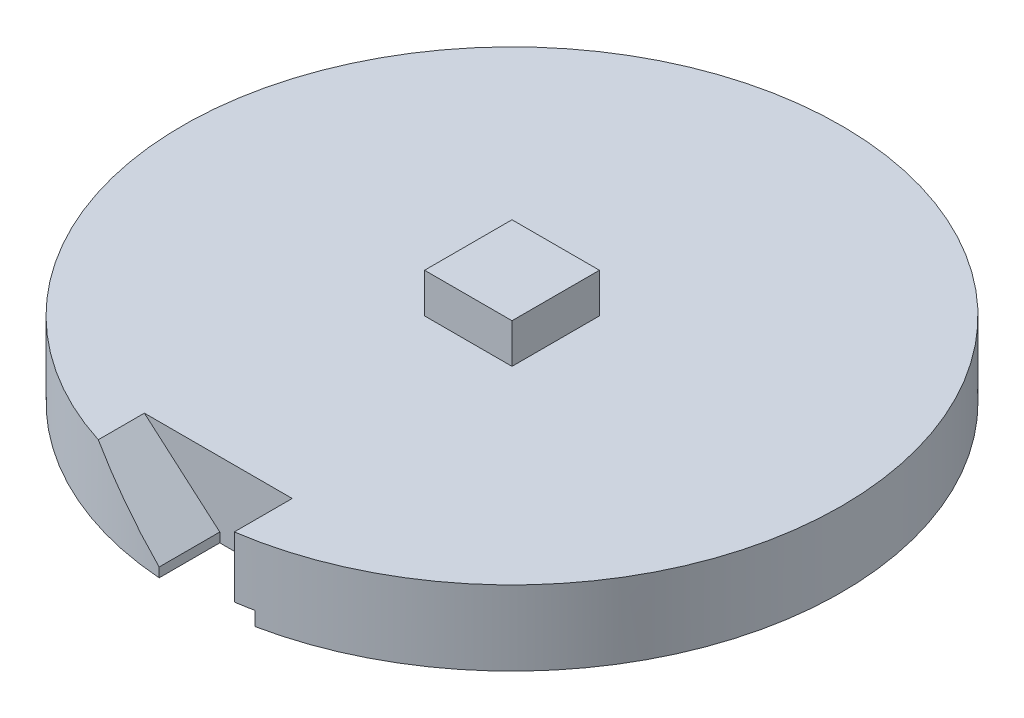
ISO-10303-21;
HEADER;
FILE_DESCRIPTION(('STEP AP214'),'2;1');
FILE_NAME('part.step','',(''),(''),'','','');
FILE_SCHEMA(('AUTOMOTIVE_DESIGN { 1 0 10303 214 1 1 1 1 }'));
ENDSEC;
DATA;
#1=APPLICATION_CONTEXT('core data for automotive mechanical design processes');
#2=APPLICATION_PROTOCOL_DEFINITION('international standard','automotive_design',2000,#1);
#3=PRODUCT_CONTEXT('',#1,'mechanical');
#4=PRODUCT('Part','Part','',(#3));
#5=PRODUCT_RELATED_PRODUCT_CATEGORY('part','',(#4));
#6=PRODUCT_DEFINITION_FORMATION('','',#4);
#7=PRODUCT_DEFINITION_CONTEXT('part definition',#1,'design');
#8=PRODUCT_DEFINITION('design','',#6,#7);
#9=PRODUCT_DEFINITION_SHAPE('','',#8);
#10=(LENGTH_UNIT() NAMED_UNIT(*) SI_UNIT(.MILLI.,.METRE.));
#11=(NAMED_UNIT(*) PLANE_ANGLE_UNIT() SI_UNIT($,.RADIAN.));
#12=(NAMED_UNIT(*) SI_UNIT($,.STERADIAN.) SOLID_ANGLE_UNIT());
#13=UNCERTAINTY_MEASURE_WITH_UNIT(LENGTH_MEASURE(1.E-05),#10,'distance_accuracy_value','');
#14=(GEOMETRIC_REPRESENTATION_CONTEXT(3) GLOBAL_UNCERTAINTY_ASSIGNED_CONTEXT((#13)) GLOBAL_UNIT_ASSIGNED_CONTEXT((#10,
#11,#12)) REPRESENTATION_CONTEXT('',''));
#15=CARTESIAN_POINT('',(0.,0.,0.));
#16=DIRECTION('',(0.,0.,1.));
#17=DIRECTION('',(1.,0.,0.));
#18=AXIS2_PLACEMENT_3D('',#15,#16,#17);
#19=CARTESIAN_POINT('',(0.,8.5,0.));
#20=DIRECTION('',(0.,1.,0.));
#21=DIRECTION('',(0.,0.,1.));
#22=AXIS2_PLACEMENT_3D('',#19,#20,#21);
#23=PLANE('',#22);
#24=DIRECTION('',(0.,0.,1.));
#25=VECTOR('',#24,1.);
#26=CARTESIAN_POINT('',(-11.3352998065365,8.5,30.5));
#27=LINE('',#26,#25);
#28=CARTESIAN_POINT('',(-11.3352998065365,8.5,30.5));
#29=VERTEX_POINT('',#28);
#30=CARTESIAN_POINT('',(-11.3352998065365,8.5,35.7457826644757));
#31=VERTEX_POINT('',#30);
#32=EDGE_CURVE('E282',#29,#31,#27,.T.);
#33=ORIENTED_EDGE('',*,*,#32,.F.);
#34=DIRECTION('',(-1.,0.,0.));
#35=VECTOR('',#34,1.);
#36=CARTESIAN_POINT('',(5.48783229101683,8.5,30.5));
#37=LINE('',#36,#35);
#38=CARTESIAN_POINT('',(5.48783229101683,8.5,30.5));
#39=VERTEX_POINT('',#38);
#40=EDGE_CURVE('E280',#39,#29,#37,.T.);
#41=ORIENTED_EDGE('',*,*,#40,.F.);
#42=DIRECTION('',(0.,0.,1.));
#43=VECTOR('',#42,1.);
#44=CARTESIAN_POINT('',(5.48783229101683,8.5,30.5));
#45=LINE('',#44,#43);
#46=CARTESIAN_POINT('',(5.48783229101683,8.5,37.0962760495669));
#47=VERTEX_POINT('',#46);
#48=EDGE_CURVE('E274',#39,#47,#45,.T.);
#49=ORIENTED_EDGE('',*,*,#48,.T.);
#50=CARTESIAN_POINT('',(0.,8.5,0.));
#51=DIRECTION('',(0.,1.,0.));
#52=DIRECTION('',(0.,0.,1.));
#53=AXIS2_PLACEMENT_3D('',#50,#51,#52);
#54=CIRCLE('',#53,37.5);
#55=EDGE_CURVE('E253',#47,#31,#54,.T.);
#56=ORIENTED_EDGE('',*,*,#55,.T.);
#57=EDGE_LOOP('',(#33,#41,#49,#56));
#58=FACE_BOUND('',#57,.T.);
#59=DIRECTION('',(1.,0.,0.));
#60=VECTOR('',#59,1.);
#61=CARTESIAN_POINT('',(0.,8.5,-4.975));
#62=LINE('',#61,#60);
#63=CARTESIAN_POINT('',(-4.975,8.5,-4.975));
#64=VERTEX_POINT('',#63);
#65=CARTESIAN_POINT('',(4.975,8.5,-4.975));
#66=VERTEX_POINT('',#65);
#67=EDGE_CURVE('E245',#64,#66,#62,.T.);
#68=ORIENTED_EDGE('',*,*,#67,.T.);
#69=DIRECTION('',(0.,0.,1.));
#70=VECTOR('',#69,1.);
#71=CARTESIAN_POINT('',(4.975,8.5,0.));
#72=LINE('',#71,#70);
#73=CARTESIAN_POINT('',(4.975,8.5,4.975));
#74=VERTEX_POINT('',#73);
#75=EDGE_CURVE('E249',#66,#74,#72,.T.);
#76=ORIENTED_EDGE('',*,*,#75,.T.);
#77=DIRECTION('',(-1.,0.,0.));
#78=VECTOR('',#77,1.);
#79=CARTESIAN_POINT('',(0.,8.5,4.975));
#80=LINE('',#79,#78);
#81=CARTESIAN_POINT('',(-4.975,8.5,4.975));
#82=VERTEX_POINT('',#81);
#83=EDGE_CURVE('E237',#74,#82,#80,.T.);
#84=ORIENTED_EDGE('',*,*,#83,.T.);
#85=DIRECTION('',(0.,0.,-1.));
#86=VECTOR('',#85,1.);
#87=CARTESIAN_POINT('',(-4.975,8.5,0.));
#88=LINE('',#87,#86);
#89=EDGE_CURVE('E241',#82,#64,#88,.T.);
#90=ORIENTED_EDGE('',*,*,#89,.T.);
#91=EDGE_LOOP('',(#68,#76,#84,#90));
#92=FACE_BOUND('',#91,.T.);
#93=ADVANCED_FACE('F45',(#58,#92),#23,.T.);
#94=CARTESIAN_POINT('',(0.,8.5,0.));
#95=DIRECTION('',(0.,-1.,0.));
#96=DIRECTION('',(0.,0.,-1.));
#97=AXIS2_PLACEMENT_3D('',#94,#95,#96);
#98=CYLINDRICAL_SURFACE('',#97,37.5);
#99=CARTESIAN_POINT('',(0.,0.,0.));
#100=DIRECTION('',(0.,1.,0.));
#101=DIRECTION('',(0.,0.,1.));
#102=AXIS2_PLACEMENT_3D('',#99,#100,#101);
#103=CIRCLE('',#102,37.5);
#104=CARTESIAN_POINT('',(7.49309439374879,0.,36.7437550667643));
#105=VERTEX_POINT('',#104);
#106=CARTESIAN_POINT('',(-2.75755208033518,0.,37.3984746550476));
#107=VERTEX_POINT('',#106);
#108=EDGE_CURVE('E167',#105,#107,#103,.T.);
#109=ORIENTED_EDGE('',*,*,#108,.T.);
#110=DIRECTION('',(0.,-1.,0.));
#111=VECTOR('',#110,1.);
#112=CARTESIAN_POINT('',(-2.75755208033518,8.5,37.3984746550476));
#113=LINE('',#112,#111);
#114=CARTESIAN_POINT('',(-2.75755208033518,1.07247206861908,37.3984746550476));
#115=VERTEX_POINT('',#114);
#116=EDGE_CURVE('E181',#107,#115,#113,.F.);
#117=ORIENTED_EDGE('',*,*,#116,.T.);
#118=CARTESIAN_POINT('',(0.,-1.315310336821,0.));
#119=DIRECTION('',(-0.654602325716553,-0.755973409033995,0.));
#120=DIRECTION('',(0.755973409033995,-0.654602325716553,0.));
#121=AXIS2_PLACEMENT_3D('',#118,#119,#120);
#122=ELLIPSE('',#121,49.6049193686833,37.5);
#123=EDGE_CURVE('E11',#115,#31,#122,.T.);
#124=ORIENTED_EDGE('',*,*,#123,.T.);
#125=ORIENTED_EDGE('',*,*,#55,.F.);
#126=DIRECTION('',(0.,-1.,0.));
#127=VECTOR('',#126,1.);
#128=CARTESIAN_POINT('',(5.48783229101683,8.5,37.0962760495669));
#129=LINE('',#128,#127);
#130=CARTESIAN_POINT('',(5.48783229101683,1.59559495075865,37.0962760495669));
#131=VERTEX_POINT('',#130);
#132=EDGE_CURVE('E54',#47,#131,#129,.T.);
#133=ORIENTED_EDGE('',*,*,#132,.T.);
#134=CARTESIAN_POINT('',(0.,1.59559495075865,0.));
#135=DIRECTION('',(0.,1.,0.));
#136=DIRECTION('',(0.,0.,1.));
#137=AXIS2_PLACEMENT_3D('',#134,#135,#136);
#138=CIRCLE('',#137,37.5);
#139=CARTESIAN_POINT('',(7.49309439374879,1.59559495075865,36.7437550667644));
#140=VERTEX_POINT('',#139);
#141=EDGE_CURVE('E151',#131,#140,#138,.T.);
#142=ORIENTED_EDGE('',*,*,#141,.T.);
#143=DIRECTION('',(0.,-1.,0.));
#144=VECTOR('',#143,1.);
#145=CARTESIAN_POINT('',(7.49309439374878,8.50000000000001,36.7437550667644));
#146=LINE('',#145,#144);
#147=EDGE_CURVE('E178',#140,#105,#146,.T.);
#148=ORIENTED_EDGE('',*,*,#147,.T.);
#149=EDGE_LOOP('',(#109,#117,#124,#125,#133,#142,#148));
#150=FACE_BOUND('',#149,.T.);
#151=ADVANCED_FACE('F47',(#150),#98,.T.);
#152=CARTESIAN_POINT('',(0.,0.,0.));
#153=DIRECTION('',(0.,1.,0.));
#154=DIRECTION('',(0.,0.,1.));
#155=AXIS2_PLACEMENT_3D('',#152,#153,#154);
#156=PLANE('',#155);
#157=CARTESIAN_POINT('',(0.,0.,0.));
#158=DIRECTION('',(0.,1.,0.));
#159=DIRECTION('',(0.,0.,1.));
#160=AXIS2_PLACEMENT_3D('',#157,#158,#159);
#161=CIRCLE('',#160,5.);
#162=CARTESIAN_POINT('',(0.,0.,5.));
#163=VERTEX_POINT('',#162);
#164=EDGE_CURVE('E152',#163,#163,#161,.F.);
#165=ORIENTED_EDGE('',*,*,#164,.F.);
#166=EDGE_LOOP('',(#165));
#167=FACE_BOUND('',#166,.T.);
#168=DIRECTION('',(-1.,0.,0.));
#169=VECTOR('',#168,1.);
#170=CARTESIAN_POINT('',(0.,0.,30.5));
#171=LINE('',#170,#169);
#172=CARTESIAN_POINT('',(7.49309439374879,0.,30.5));
#173=VERTEX_POINT('',#172);
#174=CARTESIAN_POINT('',(-2.75755208033518,0.,30.5));
#175=VERTEX_POINT('',#174);
#176=EDGE_CURVE('E142',#173,#175,#171,.T.);
#177=ORIENTED_EDGE('',*,*,#176,.T.);
#178=DIRECTION('',(0.,0.,1.));
#179=VECTOR('',#178,1.);
#180=CARTESIAN_POINT('',(-2.75755208033518,0.,30.5));
#181=LINE('',#180,#179);
#182=EDGE_CURVE('E182',#175,#107,#181,.T.);
#183=ORIENTED_EDGE('',*,*,#182,.T.);
#184=ORIENTED_EDGE('',*,*,#108,.F.);
#185=DIRECTION('',(0.,0.,1.));
#186=VECTOR('',#185,1.);
#187=CARTESIAN_POINT('',(7.49309439374879,0.,30.5));
#188=LINE('',#187,#186);
#189=EDGE_CURVE('E156',#173,#105,#188,.T.);
#190=ORIENTED_EDGE('',*,*,#189,.F.);
#191=EDGE_LOOP('',(#177,#183,#184,#190));
#192=FACE_BOUND('',#191,.T.);
#193=ADVANCED_FACE('F165',(#167,#192),#156,.F.);
#194=CARTESIAN_POINT('',(4.975,13.,-4.975));
#195=DIRECTION('',(-1.,0.,0.));
#196=DIRECTION('',(0.,0.,1.));
#197=AXIS2_PLACEMENT_3D('',#194,#195,#196);
#198=PLANE('',#197);
#199=ORIENTED_EDGE('',*,*,#75,.F.);
#200=DIRECTION('',(0.,-1.,0.));
#201=VECTOR('',#200,1.);
#202=CARTESIAN_POINT('',(4.975,13.,-4.975));
#203=LINE('',#202,#201);
#204=CARTESIAN_POINT('',(4.975,13.,-4.975));
#205=VERTEX_POINT('',#204);
#206=EDGE_CURVE('E233',#205,#66,#203,.T.);
#207=ORIENTED_EDGE('',*,*,#206,.F.);
#208=DIRECTION('',(0.,0.,-1.));
#209=VECTOR('',#208,1.);
#210=CARTESIAN_POINT('',(4.975,13.,-4.975));
#211=LINE('',#210,#209);
#212=CARTESIAN_POINT('',(4.975,13.,4.975));
#213=VERTEX_POINT('',#212);
#214=EDGE_CURVE('E209',#213,#205,#211,.T.);
#215=ORIENTED_EDGE('',*,*,#214,.F.);
#216=DIRECTION('',(0.,-1.,0.));
#217=VECTOR('',#216,1.);
#218=CARTESIAN_POINT('',(4.975,13.,4.975));
#219=LINE('',#218,#217);
#220=EDGE_CURVE('E222',#213,#74,#219,.T.);
#221=ORIENTED_EDGE('',*,*,#220,.T.);
#222=EDGE_LOOP('',(#199,#207,#215,#221));
#223=FACE_BOUND('',#222,.T.);
#224=ADVANCED_FACE('F323',(#223),#198,.F.);
#225=CARTESIAN_POINT('',(-4.975,13.,-4.975));
#226=DIRECTION('',(0.,0.,1.));
#227=DIRECTION('',(1.,0.,0.));
#228=AXIS2_PLACEMENT_3D('',#225,#226,#227);
#229=PLANE('',#228);
#230=ORIENTED_EDGE('',*,*,#67,.F.);
#231=DIRECTION('',(0.,-1.,0.));
#232=VECTOR('',#231,1.);
#233=CARTESIAN_POINT('',(-4.975,13.,-4.975));
#234=LINE('',#233,#232);
#235=CARTESIAN_POINT('',(-4.975,13.,-4.975));
#236=VERTEX_POINT('',#235);
#237=EDGE_CURVE('E229',#236,#64,#234,.T.);
#238=ORIENTED_EDGE('',*,*,#237,.F.);
#239=DIRECTION('',(-1.,0.,0.));
#240=VECTOR('',#239,1.);
#241=CARTESIAN_POINT('',(-4.975,13.,-4.975));
#242=LINE('',#241,#240);
#243=EDGE_CURVE('E213',#205,#236,#242,.T.);
#244=ORIENTED_EDGE('',*,*,#243,.F.);
#245=ORIENTED_EDGE('',*,*,#206,.T.);
#246=EDGE_LOOP('',(#230,#238,#244,#245));
#247=FACE_BOUND('',#246,.T.);
#248=ADVANCED_FACE('F331',(#247),#229,.F.);
#249=CARTESIAN_POINT('',(-4.975,13.,-4.975));
#250=DIRECTION('',(1.,0.,0.));
#251=DIRECTION('',(0.,0.,-1.));
#252=AXIS2_PLACEMENT_3D('',#249,#250,#251);
#253=PLANE('',#252);
#254=ORIENTED_EDGE('',*,*,#89,.F.);
#255=DIRECTION('',(0.,-1.,0.));
#256=VECTOR('',#255,1.);
#257=CARTESIAN_POINT('',(-4.975,13.,4.975));
#258=LINE('',#257,#256);
#259=CARTESIAN_POINT('',(-4.975,13.,4.975));
#260=VERTEX_POINT('',#259);
#261=EDGE_CURVE('E226',#260,#82,#258,.T.);
#262=ORIENTED_EDGE('',*,*,#261,.F.);
#263=DIRECTION('',(0.,0.,1.));
#264=VECTOR('',#263,1.);
#265=CARTESIAN_POINT('',(-4.975,13.,-4.975));
#266=LINE('',#265,#264);
#267=EDGE_CURVE('E216',#236,#260,#266,.T.);
#268=ORIENTED_EDGE('',*,*,#267,.F.);
#269=ORIENTED_EDGE('',*,*,#237,.T.);
#270=EDGE_LOOP('',(#254,#262,#268,#269));
#271=FACE_BOUND('',#270,.T.);
#272=ADVANCED_FACE('F356',(#271),#253,.F.);
#273=CARTESIAN_POINT('',(-4.975,13.,4.975));
#274=DIRECTION('',(0.,0.,-1.));
#275=DIRECTION('',(-1.,0.,0.));
#276=AXIS2_PLACEMENT_3D('',#273,#274,#275);
#277=PLANE('',#276);
#278=ORIENTED_EDGE('',*,*,#83,.F.);
#279=ORIENTED_EDGE('',*,*,#220,.F.);
#280=DIRECTION('',(1.,0.,0.));
#281=VECTOR('',#280,1.);
#282=CARTESIAN_POINT('',(-4.975,13.,4.975));
#283=LINE('',#282,#281);
#284=EDGE_CURVE('E219',#260,#213,#283,.T.);
#285=ORIENTED_EDGE('',*,*,#284,.F.);
#286=ORIENTED_EDGE('',*,*,#261,.T.);
#287=EDGE_LOOP('',(#278,#279,#285,#286));
#288=FACE_BOUND('',#287,.T.);
#289=ADVANCED_FACE('F348',(#288),#277,.F.);
#290=CARTESIAN_POINT('',(0.,13.,0.));
#291=DIRECTION('',(0.,1.,0.));
#292=DIRECTION('',(0.,0.,1.));
#293=AXIS2_PLACEMENT_3D('',#290,#291,#292);
#294=PLANE('',#293);
#295=ORIENTED_EDGE('',*,*,#214,.T.);
#296=ORIENTED_EDGE('',*,*,#243,.T.);
#297=ORIENTED_EDGE('',*,*,#267,.T.);
#298=ORIENTED_EDGE('',*,*,#284,.T.);
#299=EDGE_LOOP('',(#295,#296,#297,#298));
#300=FACE_BOUND('',#299,.T.);
#301=ADVANCED_FACE('F338',(#300),#294,.T.);
#302=CARTESIAN_POINT('',(0.,-10.,0.));
#303=DIRECTION('',(0.,1.,0.));
#304=DIRECTION('',(0.,0.,1.));
#305=AXIS2_PLACEMENT_3D('',#302,#303,#304);
#306=CYLINDRICAL_SURFACE('',#305,5.);
#307=CARTESIAN_POINT('',(0.,-10.,0.));
#308=DIRECTION('',(0.,-1.,0.));
#309=DIRECTION('',(0.,0.,-1.));
#310=AXIS2_PLACEMENT_3D('',#307,#308,#309);
#311=CIRCLE('',#310,5.);
#312=CARTESIAN_POINT('',(0.,-10.,-5.));
#313=VERTEX_POINT('',#312);
#314=EDGE_CURVE('E205',#313,#313,#311,.T.);
#315=ORIENTED_EDGE('',*,*,#314,.F.);
#316=EDGE_LOOP('',(#315));
#317=FACE_BOUND('',#316,.T.);
#318=ORIENTED_EDGE('',*,*,#164,.T.);
#319=EDGE_LOOP('',(#318));
#320=FACE_BOUND('',#319,.T.);
#321=ADVANCED_FACE('F335',(#317,#320),#306,.T.);
#322=CARTESIAN_POINT('',(0.,-10.,0.));
#323=DIRECTION('',(0.,-1.,0.));
#324=DIRECTION('',(0.,0.,-1.));
#325=AXIS2_PLACEMENT_3D('',#322,#323,#324);
#326=PLANE('',#325);
#327=CARTESIAN_POINT('',(0.0180115311504414,-10.,0.00676759727533257));
#328=DIRECTION('',(0.,-1.,0.));
#329=DIRECTION('',(0.,0.,-1.));
#330=AXIS2_PLACEMENT_3D('',#327,#328,#329);
#331=CIRCLE('',#330,1.55);
#332=CARTESIAN_POINT('',(0.565734088655607,-10.,-1.44323240272467));
#333=VERTEX_POINT('',#332);
#334=CARTESIAN_POINT('',(-0.529711026354725,-10.,-1.44323240272467));
#335=VERTEX_POINT('',#334);
#336=EDGE_CURVE('E69',#333,#335,#331,.T.);
#337=ORIENTED_EDGE('',*,*,#336,.F.);
#338=DIRECTION('',(1.,0.,0.));
#339=VECTOR('',#338,1.);
#340=CARTESIAN_POINT('',(0.0180115311504414,-10.,-1.44323240272467));
#341=LINE('',#340,#339);
#342=EDGE_CURVE('E190',#335,#333,#341,.T.);
#343=ORIENTED_EDGE('',*,*,#342,.F.);
#344=EDGE_LOOP('',(#337,#343));
#345=FACE_BOUND('',#344,.T.);
#346=ORIENTED_EDGE('',*,*,#314,.T.);
#347=EDGE_LOOP('',(#346));
#348=FACE_BOUND('',#347,.T.);
#349=ADVANCED_FACE('F337',(#345,#348),#326,.T.);
#350=CARTESIAN_POINT('',(0.0180115311504414,0.,0.00676759727533257));
#351=DIRECTION('',(0.,-1.,0.));
#352=DIRECTION('',(0.,0.,-1.));
#353=AXIS2_PLACEMENT_3D('',#350,#351,#352);
#354=CYLINDRICAL_SURFACE('',#353,1.55);
#355=ORIENTED_EDGE('',*,*,#336,.T.);
#356=DIRECTION('',(0.,-1.,0.));
#357=VECTOR('',#356,1.);
#358=CARTESIAN_POINT('',(-0.529711026354725,0.,-1.44323240272467));
#359=LINE('',#358,#357);
#360=CARTESIAN_POINT('',(-0.529711026354725,0.,-1.44323240272467));
#361=VERTEX_POINT('',#360);
#362=EDGE_CURVE('E202',#361,#335,#359,.T.);
#363=ORIENTED_EDGE('',*,*,#362,.F.);
#364=CARTESIAN_POINT('',(0.0180115311504414,0.,0.00676759727533257));
#365=DIRECTION('',(0.,-1.,0.));
#366=DIRECTION('',(0.,0.,-1.));
#367=AXIS2_PLACEMENT_3D('',#364,#365,#366);
#368=CIRCLE('',#367,1.55);
#369=CARTESIAN_POINT('',(0.565734088655607,0.,-1.44323240272467));
#370=VERTEX_POINT('',#369);
#371=EDGE_CURVE('E189',#370,#361,#368,.T.);
#372=ORIENTED_EDGE('',*,*,#371,.F.);
#373=DIRECTION('',(0.,-1.,0.));
#374=VECTOR('',#373,1.);
#375=CARTESIAN_POINT('',(0.565734088655607,0.,-1.44323240272467));
#376=LINE('',#375,#374);
#377=EDGE_CURVE('E194',#370,#333,#376,.T.);
#378=ORIENTED_EDGE('',*,*,#377,.T.);
#379=EDGE_LOOP('',(#355,#363,#372,#378));
#380=FACE_BOUND('',#379,.T.);
#381=ADVANCED_FACE('F345',(#380),#354,.F.);
#382=CARTESIAN_POINT('',(0.0180115311504414,0.,-1.44323240272467));
#383=DIRECTION('',(0.,0.,-1.));
#384=DIRECTION('',(-1.,0.,0.));
#385=AXIS2_PLACEMENT_3D('',#382,#383,#384);
#386=PLANE('',#385);
#387=ORIENTED_EDGE('',*,*,#342,.T.);
#388=ORIENTED_EDGE('',*,*,#377,.F.);
#389=DIRECTION('',(-1.,0.,0.));
#390=VECTOR('',#389,1.);
#391=CARTESIAN_POINT('',(0.0180115311504414,0.,-1.44323240272467));
#392=LINE('',#391,#390);
#393=EDGE_CURVE('E186',#370,#361,#392,.T.);
#394=ORIENTED_EDGE('',*,*,#393,.T.);
#395=ORIENTED_EDGE('',*,*,#362,.T.);
#396=EDGE_LOOP('',(#387,#388,#394,#395));
#397=FACE_BOUND('',#396,.T.);
#398=ADVANCED_FACE('F409',(#397),#386,.F.);
#399=CARTESIAN_POINT('',(0.0180115311504414,0.,0.00676759727533257));
#400=DIRECTION('',(0.,-1.,0.));
#401=DIRECTION('',(0.,0.,-1.));
#402=AXIS2_PLACEMENT_3D('',#399,#400,#401);
#403=PLANE('',#402);
#404=ORIENTED_EDGE('',*,*,#393,.F.);
#405=ORIENTED_EDGE('',*,*,#371,.T.);
#406=EDGE_LOOP('',(#404,#405));
#407=FACE_BOUND('',#406,.T.);
#408=ADVANCED_FACE('F417',(#407),#403,.T.);
#409=CARTESIAN_POINT('',(-11.3352998065365,8.5,30.5));
#410=DIRECTION('',(-0.654602325716553,-0.755973409033995,0.));
#411=DIRECTION('',(0.755973409033995,-0.654602325716553,0.));
#412=AXIS2_PLACEMENT_3D('',#409,#410,#411);
#413=PLANE('',#412);
#414=DIRECTION('',(0.,0.,1.));
#415=VECTOR('',#414,1.);
#416=CARTESIAN_POINT('',(-2.75755208033518,1.07247206861908,30.5));
#417=LINE('',#416,#415);
#418=CARTESIAN_POINT('',(-2.75755208033518,1.07247206861908,30.5));
#419=VERTEX_POINT('',#418);
#420=EDGE_CURVE('E286',#419,#115,#417,.T.);
#421=ORIENTED_EDGE('',*,*,#420,.F.);
#422=DIRECTION('',(0.755973409033995,-0.654602325716553,0.));
#423=VECTOR('',#422,1.);
#424=CARTESIAN_POINT('',(-11.3352998065365,8.5,30.5));
#425=LINE('',#424,#423);
#426=EDGE_CURVE('E174',#29,#419,#425,.T.);
#427=ORIENTED_EDGE('',*,*,#426,.F.);
#428=ORIENTED_EDGE('',*,*,#32,.T.);
#429=ORIENTED_EDGE('',*,*,#123,.F.);
#430=EDGE_LOOP('',(#421,#427,#428,#429));
#431=FACE_BOUND('',#430,.T.);
#432=ADVANCED_FACE('F313',(#431),#413,.F.);
#433=CARTESIAN_POINT('',(5.48783229101683,5.96572027218461,30.5));
#434=DIRECTION('',(1.,0.,0.));
#435=DIRECTION('',(0.,0.,-1.));
#436=AXIS2_PLACEMENT_3D('',#433,#434,#435);
#437=PLANE('',#436);
#438=ORIENTED_EDGE('',*,*,#48,.F.);
#439=DIRECTION('',(0.,1.,0.));
#440=VECTOR('',#439,1.);
#441=CARTESIAN_POINT('',(5.48783229101683,5.96572027218461,30.5));
#442=LINE('',#441,#440);
#443=CARTESIAN_POINT('',(5.48783229101683,1.59559495075865,30.5));
#444=VERTEX_POINT('',#443);
#445=EDGE_CURVE('E298',#444,#39,#442,.T.);
#446=ORIENTED_EDGE('',*,*,#445,.F.);
#447=DIRECTION('',(0.,0.,1.));
#448=VECTOR('',#447,1.);
#449=CARTESIAN_POINT('',(5.48783229101683,1.59559495075865,30.5));
#450=LINE('',#449,#448);
#451=EDGE_CURVE('E172',#444,#131,#450,.T.);
#452=ORIENTED_EDGE('',*,*,#451,.T.);
#453=ORIENTED_EDGE('',*,*,#132,.F.);
#454=EDGE_LOOP('',(#438,#446,#452,#453));
#455=FACE_BOUND('',#454,.T.);
#456=ADVANCED_FACE('F272',(#455),#437,.F.);
#457=CARTESIAN_POINT('',(5.48783229101683,1.59559495075865,30.5));
#458=DIRECTION('',(0.,1.,0.));
#459=DIRECTION('',(0.,0.,1.));
#460=AXIS2_PLACEMENT_3D('',#457,#458,#459);
#461=PLANE('',#460);
#462=ORIENTED_EDGE('',*,*,#451,.F.);
#463=DIRECTION('',(-1.,0.,0.));
#464=VECTOR('',#463,1.);
#465=CARTESIAN_POINT('',(5.48783229101683,1.59559495075865,30.5));
#466=LINE('',#465,#464);
#467=CARTESIAN_POINT('',(7.49309439374879,1.59559495075865,30.5));
#468=VERTEX_POINT('',#467);
#469=EDGE_CURVE('E162',#468,#444,#466,.T.);
#470=ORIENTED_EDGE('',*,*,#469,.F.);
#471=DIRECTION('',(0.,0.,1.));
#472=VECTOR('',#471,1.);
#473=CARTESIAN_POINT('',(7.49309439374879,1.59559495075865,30.5));
#474=LINE('',#473,#472);
#475=EDGE_CURVE('E159',#468,#140,#474,.T.);
#476=ORIENTED_EDGE('',*,*,#475,.T.);
#477=ORIENTED_EDGE('',*,*,#141,.F.);
#478=EDGE_LOOP('',(#462,#470,#476,#477));
#479=FACE_BOUND('',#478,.T.);
#480=ADVANCED_FACE('F303',(#479),#461,.F.);
#481=CARTESIAN_POINT('',(-2.75755208033518,0.,30.5));
#482=DIRECTION('',(-1.,0.,0.));
#483=DIRECTION('',(0.,0.,1.));
#484=AXIS2_PLACEMENT_3D('',#481,#482,#483);
#485=PLANE('',#484);
#486=ORIENTED_EDGE('',*,*,#182,.F.);
#487=DIRECTION('',(0.,-1.,0.));
#488=VECTOR('',#487,1.);
#489=CARTESIAN_POINT('',(-2.75755208033518,0.,30.5));
#490=LINE('',#489,#488);
#491=EDGE_CURVE('E61',#419,#175,#490,.T.);
#492=ORIENTED_EDGE('',*,*,#491,.F.);
#493=ORIENTED_EDGE('',*,*,#420,.T.);
#494=ORIENTED_EDGE('',*,*,#116,.F.);
#495=EDGE_LOOP('',(#486,#492,#493,#494));
#496=FACE_BOUND('',#495,.T.);
#497=ADVANCED_FACE('F305',(#496),#485,.F.);
#498=CARTESIAN_POINT('',(7.49309439374879,1.59559495075865,30.5));
#499=DIRECTION('',(1.,0.,0.));
#500=DIRECTION('',(0.,1.,0.));
#501=AXIS2_PLACEMENT_3D('',#498,#499,#500);
#502=PLANE('',#501);
#503=ORIENTED_EDGE('',*,*,#475,.F.);
#504=DIRECTION('',(0.,1.,0.));
#505=VECTOR('',#504,1.);
#506=CARTESIAN_POINT('',(7.49309439374879,1.59559495075865,30.5));
#507=LINE('',#506,#505);
#508=EDGE_CURVE('E146',#173,#468,#507,.T.);
#509=ORIENTED_EDGE('',*,*,#508,.F.);
#510=ORIENTED_EDGE('',*,*,#189,.T.);
#511=ORIENTED_EDGE('',*,*,#147,.F.);
#512=EDGE_LOOP('',(#503,#509,#510,#511));
#513=FACE_BOUND('',#512,.T.);
#514=ADVANCED_FACE('F155',(#513),#502,.F.);
#515=CARTESIAN_POINT('',(0.,0.,30.5));
#516=DIRECTION('',(0.,0.,-1.));
#517=DIRECTION('',(-1.,0.,0.));
#518=AXIS2_PLACEMENT_3D('',#515,#516,#517);
#519=PLANE('',#518);
#520=ORIENTED_EDGE('',*,*,#508,.T.);
#521=ORIENTED_EDGE('',*,*,#469,.T.);
#522=ORIENTED_EDGE('',*,*,#445,.T.);
#523=ORIENTED_EDGE('',*,*,#40,.T.);
#524=ORIENTED_EDGE('',*,*,#426,.T.);
#525=ORIENTED_EDGE('',*,*,#491,.T.);
#526=ORIENTED_EDGE('',*,*,#176,.F.);
#527=EDGE_LOOP('',(#520,#521,#522,#523,#524,#525,#526));
#528=FACE_BOUND('',#527,.T.);
#529=ADVANCED_FACE('F144',(#528),#519,.F.);
#530=CLOSED_SHELL('',(#93,#151,#193,#224,#248,#272,#289,#301,#321,#349,#381,#398,#408,#432,#456,
#480,#497,#514,#529));
#531=MANIFOLD_SOLID_BREP('B2',#530);
#532=ADVANCED_BREP_SHAPE_REPRESENTATION('',(#18,#531),#14);
#533=SHAPE_DEFINITION_REPRESENTATION(#9,#532);
ENDSEC;
END-ISO-10303-21;
